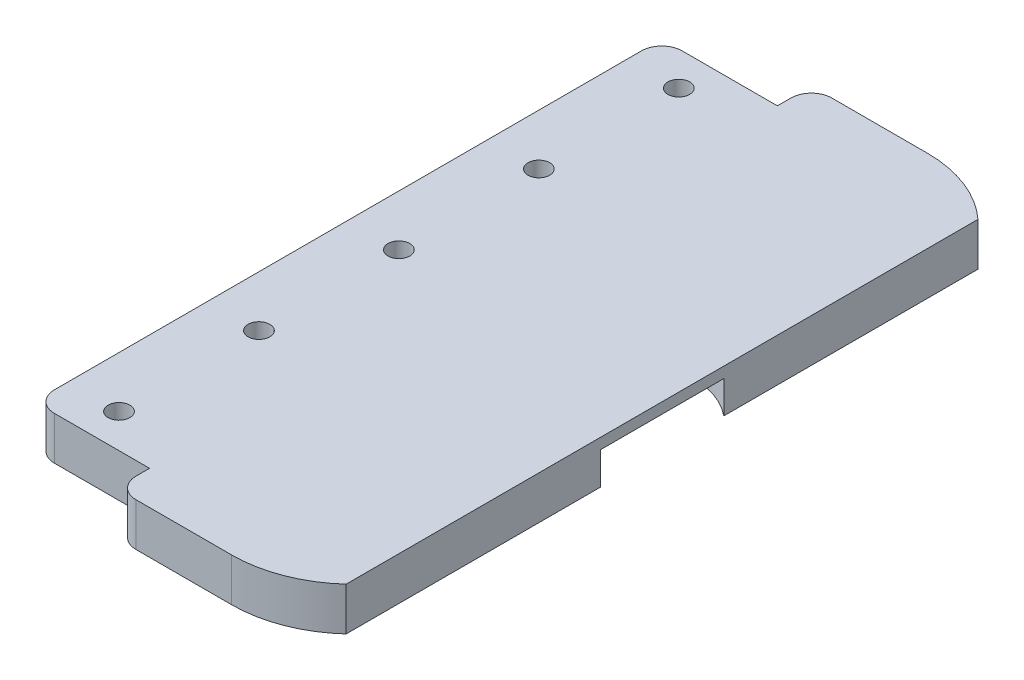
ISO-10303-21;
HEADER;
FILE_DESCRIPTION(('STEP AP214'),'2;1');
FILE_NAME('part.step','',(''),(''),'','','');
FILE_SCHEMA(('AUTOMOTIVE_DESIGN { 1 0 10303 214 1 1 1 1 }'));
ENDSEC;
DATA;
#1=APPLICATION_CONTEXT('core data for automotive mechanical design processes');
#2=APPLICATION_PROTOCOL_DEFINITION('international standard','automotive_design',2000,#1);
#3=PRODUCT_CONTEXT('',#1,'mechanical');
#4=PRODUCT('Part','Part','',(#3));
#5=PRODUCT_RELATED_PRODUCT_CATEGORY('part','',(#4));
#6=PRODUCT_DEFINITION_FORMATION('','',#4);
#7=PRODUCT_DEFINITION_CONTEXT('part definition',#1,'design');
#8=PRODUCT_DEFINITION('design','',#6,#7);
#9=PRODUCT_DEFINITION_SHAPE('','',#8);
#10=(LENGTH_UNIT() NAMED_UNIT(*) SI_UNIT(.MILLI.,.METRE.));
#11=(NAMED_UNIT(*) PLANE_ANGLE_UNIT() SI_UNIT($,.RADIAN.));
#12=(NAMED_UNIT(*) SI_UNIT($,.STERADIAN.) SOLID_ANGLE_UNIT());
#13=UNCERTAINTY_MEASURE_WITH_UNIT(LENGTH_MEASURE(1.E-05),#10,'distance_accuracy_value','');
#14=(GEOMETRIC_REPRESENTATION_CONTEXT(3) GLOBAL_UNCERTAINTY_ASSIGNED_CONTEXT((#13)) GLOBAL_UNIT_ASSIGNED_CONTEXT((#10,
#11,#12)) REPRESENTATION_CONTEXT('',''));
#15=CARTESIAN_POINT('',(0.,0.,0.));
#16=DIRECTION('',(0.,0.,1.));
#17=DIRECTION('',(1.,0.,0.));
#18=AXIS2_PLACEMENT_3D('',#15,#16,#17);
#19=CARTESIAN_POINT('',(38.876,37.2383188757529,-51.18));
#20=DIRECTION('',(0.,-1.,0.));
#21=DIRECTION('',(0.,0.,-1.));
#22=AXIS2_PLACEMENT_3D('',#19,#20,#21);
#23=CYLINDRICAL_SURFACE('',#22,11.684);
#24=DIRECTION('',(0.,-1.,0.));
#25=VECTOR('',#24,1.);
#26=CARTESIAN_POINT('',(46.2193008783632,37.2383188757529,-60.2680024323186));
#27=LINE('',#26,#25);
#28=CARTESIAN_POINT('',(46.2193008783632,4.7625,-60.2680024323186));
#29=VERTEX_POINT('',#28);
#30=CARTESIAN_POINT('',(46.2193008783632,0.,-60.2680024323186));
#31=VERTEX_POINT('',#30);
#32=EDGE_CURVE('E337',#29,#31,#27,.T.);
#33=ORIENTED_EDGE('',*,*,#32,.F.);
#34=CARTESIAN_POINT('',(38.876,4.7625,-51.18));
#35=DIRECTION('',(0.,-1.,0.));
#36=DIRECTION('',(0.,0.,-1.));
#37=AXIS2_PLACEMENT_3D('',#34,#35,#36);
#38=CIRCLE('',#37,11.684);
#39=CARTESIAN_POINT('',(30.3603757715597,4.7625,-59.18));
#40=VERTEX_POINT('',#39);
#41=EDGE_CURVE('E291',#40,#29,#38,.T.);
#42=ORIENTED_EDGE('',*,*,#41,.F.);
#43=DIRECTION('',(0.,-1.,0.));
#44=VECTOR('',#43,1.);
#45=CARTESIAN_POINT('',(30.3603757715597,37.2383188757529,-59.18));
#46=LINE('',#45,#44);
#47=CARTESIAN_POINT('',(30.3603757715597,0.,-59.18));
#48=VERTEX_POINT('',#47);
#49=EDGE_CURVE('E298',#40,#48,#46,.T.);
#50=ORIENTED_EDGE('',*,*,#49,.T.);
#51=CARTESIAN_POINT('',(38.876,0.,-51.18));
#52=DIRECTION('',(0.,1.,0.));
#53=DIRECTION('',(0.,0.,1.));
#54=AXIS2_PLACEMENT_3D('',#51,#52,#53);
#55=CIRCLE('',#54,11.684);
#56=EDGE_CURVE('E304',#31,#48,#55,.T.);
#57=ORIENTED_EDGE('',*,*,#56,.F.);
#58=EDGE_LOOP('',(#33,#42,#50,#57));
#59=FACE_BOUND('',#58,.T.);
#60=ADVANCED_FACE('F39',(#59),#23,.F.);
#61=CARTESIAN_POINT('',(0.,0.,0.));
#62=DIRECTION('',(0.,-1.,0.));
#63=DIRECTION('',(0.,0.,-1.));
#64=AXIS2_PLACEMENT_3D('',#61,#62,#63);
#65=PLANE('',#64);
#66=DIRECTION('',(0.,0.,-1.));
#67=VECTOR('',#66,1.);
#68=CARTESIAN_POINT('',(46.2193008783632,0.,-4.70584818081287));
#69=LINE('',#68,#67);
#70=CARTESIAN_POINT('',(46.2193008783632,0.,-4.70584818081287));
#71=VERTEX_POINT('',#70);
#72=CARTESIAN_POINT('',(46.2193008783632,0.,-42.0919975676814));
#73=VERTEX_POINT('',#72);
#74=EDGE_CURVE('E180',#71,#73,#69,.T.);
#75=ORIENTED_EDGE('',*,*,#74,.F.);
#76=CARTESIAN_POINT('',(34.084,0.,-18.));
#77=DIRECTION('',(0.,-1.,0.));
#78=DIRECTION('',(0.,0.,-1.));
#79=AXIS2_PLACEMENT_3D('',#76,#77,#78);
#80=CIRCLE('',#79,18.);
#81=CARTESIAN_POINT('',(34.084,0.,0.));
#82=VERTEX_POINT('',#81);
#83=EDGE_CURVE('E190',#71,#82,#80,.T.);
#84=ORIENTED_EDGE('',*,*,#83,.T.);
#85=DIRECTION('',(1.,0.,0.));
#86=VECTOR('',#85,1.);
#87=CARTESIAN_POINT('',(0.,0.,0.));
#88=LINE('',#87,#86);
#89=CARTESIAN_POINT('',(20.,0.,0.));
#90=VERTEX_POINT('',#89);
#91=EDGE_CURVE('E231',#90,#82,#88,.T.);
#92=ORIENTED_EDGE('',*,*,#91,.F.);
#93=CARTESIAN_POINT('',(20.,0.,-3.));
#94=DIRECTION('',(0.,-1.,0.));
#95=DIRECTION('',(0.,0.,-1.));
#96=AXIS2_PLACEMENT_3D('',#93,#94,#95);
#97=CIRCLE('',#96,3.);
#98=CARTESIAN_POINT('',(17.,0.,-3.));
#99=VERTEX_POINT('',#98);
#100=EDGE_CURVE('E198',#90,#99,#97,.T.);
#101=ORIENTED_EDGE('',*,*,#100,.T.);
#102=DIRECTION('',(0.,0.,-1.));
#103=VECTOR('',#102,1.);
#104=CARTESIAN_POINT('',(17.,0.,0.));
#105=LINE('',#104,#103);
#106=CARTESIAN_POINT('',(17.,0.,-5.));
#107=VERTEX_POINT('',#106);
#108=EDGE_CURVE('E341',#99,#107,#105,.T.);
#109=ORIENTED_EDGE('',*,*,#108,.T.);
#110=DIRECTION('',(-1.,0.,0.));
#111=VECTOR('',#110,1.);
#112=CARTESIAN_POINT('',(17.,0.,-5.));
#113=LINE('',#112,#111);
#114=CARTESIAN_POINT('',(3.,0.,-5.));
#115=VERTEX_POINT('',#114);
#116=EDGE_CURVE('E332',#107,#115,#113,.T.);
#117=ORIENTED_EDGE('',*,*,#116,.T.);
#118=CARTESIAN_POINT('',(3.,0.,-8.));
#119=DIRECTION('',(0.,-1.,0.));
#120=DIRECTION('',(0.,0.,-1.));
#121=AXIS2_PLACEMENT_3D('',#118,#119,#120);
#122=CIRCLE('',#121,3.);
#123=CARTESIAN_POINT('',(0.,0.,-8.));
#124=VERTEX_POINT('',#123);
#125=EDGE_CURVE('E200',#115,#124,#122,.T.);
#126=ORIENTED_EDGE('',*,*,#125,.T.);
#127=DIRECTION('',(0.,0.,-1.));
#128=VECTOR('',#127,1.);
#129=CARTESIAN_POINT('',(0.,0.,0.));
#130=LINE('',#129,#128);
#131=CARTESIAN_POINT('',(0.,0.,-94.362));
#132=VERTEX_POINT('',#131);
#133=EDGE_CURVE('E248',#124,#132,#130,.T.);
#134=ORIENTED_EDGE('',*,*,#133,.T.);
#135=CARTESIAN_POINT('',(3.,0.,-94.362));
#136=DIRECTION('',(0.,-1.,0.));
#137=DIRECTION('',(0.,0.,-1.));
#138=AXIS2_PLACEMENT_3D('',#135,#136,#137);
#139=CIRCLE('',#138,3.);
#140=CARTESIAN_POINT('',(3.,0.,-97.362));
#141=VERTEX_POINT('',#140);
#142=EDGE_CURVE('E202',#132,#141,#139,.T.);
#143=ORIENTED_EDGE('',*,*,#142,.T.);
#144=DIRECTION('',(1.,0.,0.));
#145=VECTOR('',#144,1.);
#146=CARTESIAN_POINT('',(0.,0.,-97.362));
#147=LINE('',#146,#145);
#148=CARTESIAN_POINT('',(17.,0.,-97.362));
#149=VERTEX_POINT('',#148);
#150=EDGE_CURVE('E330',#141,#149,#147,.T.);
#151=ORIENTED_EDGE('',*,*,#150,.T.);
#152=DIRECTION('',(0.,0.,1.));
#153=VECTOR('',#152,1.);
#154=CARTESIAN_POINT('',(17.,0.,-102.362));
#155=LINE('',#154,#153);
#156=CARTESIAN_POINT('',(17.,0.,-99.362));
#157=VERTEX_POINT('',#156);
#158=EDGE_CURVE('E325',#157,#149,#155,.T.);
#159=ORIENTED_EDGE('',*,*,#158,.F.);
#160=CARTESIAN_POINT('',(20.,0.,-99.362));
#161=DIRECTION('',(0.,-1.,0.));
#162=DIRECTION('',(0.,0.,-1.));
#163=AXIS2_PLACEMENT_3D('',#160,#161,#162);
#164=CIRCLE('',#163,3.);
#165=CARTESIAN_POINT('',(20.,0.,-102.362));
#166=VERTEX_POINT('',#165);
#167=EDGE_CURVE('E204',#157,#166,#164,.T.);
#168=ORIENTED_EDGE('',*,*,#167,.T.);
#169=DIRECTION('',(1.,0.,0.));
#170=VECTOR('',#169,1.);
#171=CARTESIAN_POINT('',(0.,0.,-102.362));
#172=LINE('',#171,#170);
#173=CARTESIAN_POINT('',(34.084,0.,-102.362));
#174=VERTEX_POINT('',#173);
#175=EDGE_CURVE('E243',#166,#174,#172,.T.);
#176=ORIENTED_EDGE('',*,*,#175,.T.);
#177=CARTESIAN_POINT('',(34.084,0.,-84.362));
#178=DIRECTION('',(0.,-1.,0.));
#179=DIRECTION('',(0.,0.,-1.));
#180=AXIS2_PLACEMENT_3D('',#177,#178,#179);
#181=CIRCLE('',#180,18.);
#182=CARTESIAN_POINT('',(46.2193008783632,0.,-97.6561518191871));
#183=VERTEX_POINT('',#182);
#184=EDGE_CURVE('E252',#174,#183,#181,.T.);
#185=ORIENTED_EDGE('',*,*,#184,.T.);
#186=EDGE_CURVE('E54',#31,#183,#69,.T.);
#187=ORIENTED_EDGE('',*,*,#186,.F.);
#188=ORIENTED_EDGE('',*,*,#56,.T.);
#189=DIRECTION('',(0.,0.,-1.));
#190=VECTOR('',#189,1.);
#191=CARTESIAN_POINT('',(30.3603757715597,0.,0.));
#192=LINE('',#191,#190);
#193=CARTESIAN_POINT('',(30.3603757715597,0.,-43.18));
#194=VERTEX_POINT('',#193);
#195=EDGE_CURVE('E305',#194,#48,#192,.T.);
#196=ORIENTED_EDGE('',*,*,#195,.F.);
#197=EDGE_CURVE('E301',#194,#73,#55,.T.);
#198=ORIENTED_EDGE('',*,*,#197,.T.);
#199=EDGE_LOOP('',(#75,#84,#92,#101,#109,#117,#126,#134,#143,#151,#159,#168,#176,#185,#187,#188,
#196,#198));
#200=FACE_BOUND('',#199,.T.);
#201=CARTESIAN_POINT('',(38.876,0.,-95.63));
#202=DIRECTION('',(0.,1.,0.));
#203=DIRECTION('',(0.,0.,1.));
#204=AXIS2_PLACEMENT_3D('',#201,#202,#203);
#205=CIRCLE('',#204,3.55600000000001);
#206=CARTESIAN_POINT('',(38.876,0.,-92.074));
#207=VERTEX_POINT('',#206);
#208=EDGE_CURVE('E308',#207,#207,#205,.T.);
#209=ORIENTED_EDGE('',*,*,#208,.T.);
#210=EDGE_LOOP('',(#209));
#211=FACE_BOUND('',#210,.T.);
#212=CARTESIAN_POINT('',(7.50000000000086,0.,-10.002));
#213=DIRECTION('',(0.,1.,0.));
#214=DIRECTION('',(0.,0.,1.));
#215=AXIS2_PLACEMENT_3D('',#212,#213,#214);
#216=CIRCLE('',#215,1.6);
#217=CARTESIAN_POINT('',(7.50000000000086,0.,-8.40200000000001));
#218=VERTEX_POINT('',#217);
#219=EDGE_CURVE('E270',#218,#218,#216,.T.);
#220=ORIENTED_EDGE('',*,*,#219,.T.);
#221=EDGE_LOOP('',(#220));
#222=FACE_BOUND('',#221,.T.);
#223=CARTESIAN_POINT('',(7.50000000000065,0.,-30.592));
#224=DIRECTION('',(0.,1.,0.));
#225=DIRECTION('',(0.,0.,1.));
#226=AXIS2_PLACEMENT_3D('',#223,#224,#225);
#227=CIRCLE('',#226,1.6);
#228=CARTESIAN_POINT('',(7.50000000000065,0.,-28.992));
#229=VERTEX_POINT('',#228);
#230=EDGE_CURVE('E277',#229,#229,#227,.T.);
#231=ORIENTED_EDGE('',*,*,#230,.T.);
#232=EDGE_LOOP('',(#231));
#233=FACE_BOUND('',#232,.T.);
#234=CARTESIAN_POINT('',(7.50000000000043,0.,-51.182));
#235=DIRECTION('',(0.,1.,0.));
#236=DIRECTION('',(0.,0.,1.));
#237=AXIS2_PLACEMENT_3D('',#234,#235,#236);
#238=CIRCLE('',#237,1.6);
#239=CARTESIAN_POINT('',(7.50000000000043,0.,-49.582));
#240=VERTEX_POINT('',#239);
#241=EDGE_CURVE('E283',#240,#240,#238,.T.);
#242=ORIENTED_EDGE('',*,*,#241,.T.);
#243=EDGE_LOOP('',(#242));
#244=FACE_BOUND('',#243,.T.);
#245=CARTESIAN_POINT('',(7.5,0.,-92.362));
#246=DIRECTION('',(0.,1.,0.));
#247=DIRECTION('',(0.,0.,1.));
#248=AXIS2_PLACEMENT_3D('',#245,#246,#247);
#249=CIRCLE('',#248,1.6);
#250=CARTESIAN_POINT('',(7.5,0.,-90.762));
#251=VERTEX_POINT('',#250);
#252=EDGE_CURVE('E264',#251,#251,#249,.T.);
#253=ORIENTED_EDGE('',*,*,#252,.T.);
#254=EDGE_LOOP('',(#253));
#255=FACE_BOUND('',#254,.T.);
#256=CARTESIAN_POINT('',(7.50000000000022,0.,-71.772));
#257=DIRECTION('',(0.,1.,0.));
#258=DIRECTION('',(0.,0.,1.));
#259=AXIS2_PLACEMENT_3D('',#256,#257,#258);
#260=CIRCLE('',#259,1.6);
#261=CARTESIAN_POINT('',(7.50000000000022,0.,-70.172));
#262=VERTEX_POINT('',#261);
#263=EDGE_CURVE('E259',#262,#262,#260,.T.);
#264=ORIENTED_EDGE('',*,*,#263,.T.);
#265=EDGE_LOOP('',(#264));
#266=FACE_BOUND('',#265,.T.);
#267=CARTESIAN_POINT('',(38.876,0.,-6.73));
#268=DIRECTION('',(0.,1.,0.));
#269=DIRECTION('',(0.,0.,1.));
#270=AXIS2_PLACEMENT_3D('',#267,#268,#269);
#271=CIRCLE('',#270,3.556);
#272=CARTESIAN_POINT('',(38.876,0.,-3.174));
#273=VERTEX_POINT('',#272);
#274=EDGE_CURVE('E311',#273,#273,#271,.T.);
#275=ORIENTED_EDGE('',*,*,#274,.T.);
#276=EDGE_LOOP('',(#275));
#277=FACE_BOUND('',#276,.T.);
#278=ADVANCED_FACE('F238',(#200,#211,#222,#233,#244,#255,#266,#277),#65,.T.);
#279=CARTESIAN_POINT('',(0.,6.35,0.));
#280=DIRECTION('',(-1.,0.,0.));
#281=DIRECTION('',(0.,0.,1.));
#282=AXIS2_PLACEMENT_3D('',#279,#280,#281);
#283=PLANE('',#282);
#284=DIRECTION('',(0.,0.,-1.));
#285=VECTOR('',#284,1.);
#286=CARTESIAN_POINT('',(0.,6.35,0.));
#287=LINE('',#286,#285);
#288=CARTESIAN_POINT('',(0.,6.35,-8.));
#289=VERTEX_POINT('',#288);
#290=CARTESIAN_POINT('',(0.,6.35,-94.362));
#291=VERTEX_POINT('',#290);
#292=EDGE_CURVE('E242',#289,#291,#287,.T.);
#293=ORIENTED_EDGE('',*,*,#292,.T.);
#294=DIRECTION('',(0.,-1.,0.));
#295=VECTOR('',#294,1.);
#296=CARTESIAN_POINT('',(0.,6.35,-94.362));
#297=LINE('',#296,#295);
#298=EDGE_CURVE('E217',#291,#132,#297,.T.);
#299=ORIENTED_EDGE('',*,*,#298,.T.);
#300=ORIENTED_EDGE('',*,*,#133,.F.);
#301=DIRECTION('',(0.,-1.,0.));
#302=VECTOR('',#301,1.);
#303=CARTESIAN_POINT('',(0.,6.35,-8.));
#304=LINE('',#303,#302);
#305=EDGE_CURVE('E215',#124,#289,#304,.F.);
#306=ORIENTED_EDGE('',*,*,#305,.T.);
#307=EDGE_LOOP('',(#293,#299,#300,#306));
#308=FACE_BOUND('',#307,.T.);
#309=ADVANCED_FACE('F375',(#308),#283,.T.);
#310=CARTESIAN_POINT('',(0.,6.35,0.));
#311=DIRECTION('',(0.,0.,-1.));
#312=DIRECTION('',(-1.,0.,0.));
#313=AXIS2_PLACEMENT_3D('',#310,#311,#312);
#314=PLANE('',#313);
#315=DIRECTION('',(1.,0.,0.));
#316=VECTOR('',#315,1.);
#317=CARTESIAN_POINT('',(0.,6.35,0.));
#318=LINE('',#317,#316);
#319=CARTESIAN_POINT('',(20.,6.35,0.));
#320=VERTEX_POINT('',#319);
#321=CARTESIAN_POINT('',(34.084,6.35,0.));
#322=VERTEX_POINT('',#321);
#323=EDGE_CURVE('E233',#320,#322,#318,.T.);
#324=ORIENTED_EDGE('',*,*,#323,.F.);
#325=DIRECTION('',(0.,-1.,0.));
#326=VECTOR('',#325,1.);
#327=CARTESIAN_POINT('',(20.,0.,0.));
#328=LINE('',#327,#326);
#329=EDGE_CURVE('E47',#320,#90,#328,.T.);
#330=ORIENTED_EDGE('',*,*,#329,.T.);
#331=ORIENTED_EDGE('',*,*,#91,.T.);
#332=DIRECTION('',(0.,-1.,0.));
#333=VECTOR('',#332,1.);
#334=CARTESIAN_POINT('',(34.084,6.35,0.));
#335=LINE('',#334,#333);
#336=EDGE_CURVE('E186',#82,#322,#335,.F.);
#337=ORIENTED_EDGE('',*,*,#336,.T.);
#338=EDGE_LOOP('',(#324,#330,#331,#337));
#339=FACE_BOUND('',#338,.T.);
#340=ADVANCED_FACE('F230',(#339),#314,.F.);
#341=CARTESIAN_POINT('',(0.,6.35,0.));
#342=DIRECTION('',(0.,-1.,0.));
#343=DIRECTION('',(0.,0.,-1.));
#344=AXIS2_PLACEMENT_3D('',#341,#342,#343);
#345=PLANE('',#344);
#346=CARTESIAN_POINT('',(7.50000000000086,6.35,-10.002));
#347=DIRECTION('',(0.,1.,0.));
#348=DIRECTION('',(0.,0.,1.));
#349=AXIS2_PLACEMENT_3D('',#346,#347,#348);
#350=CIRCLE('',#349,1.6);
#351=CARTESIAN_POINT('',(7.50000000000086,6.35,-8.40200000000001));
#352=VERTEX_POINT('',#351);
#353=EDGE_CURVE('E267',#352,#352,#350,.T.);
#354=ORIENTED_EDGE('',*,*,#353,.F.);
#355=EDGE_LOOP('',(#354));
#356=FACE_BOUND('',#355,.T.);
#357=CARTESIAN_POINT('',(7.50000000000065,6.35,-30.592));
#358=DIRECTION('',(0.,1.,0.));
#359=DIRECTION('',(0.,0.,1.));
#360=AXIS2_PLACEMENT_3D('',#357,#358,#359);
#361=CIRCLE('',#360,1.6);
#362=CARTESIAN_POINT('',(7.50000000000065,6.35,-28.992));
#363=VERTEX_POINT('',#362);
#364=EDGE_CURVE('E274',#363,#363,#361,.T.);
#365=ORIENTED_EDGE('',*,*,#364,.F.);
#366=EDGE_LOOP('',(#365));
#367=FACE_BOUND('',#366,.T.);
#368=CARTESIAN_POINT('',(7.50000000000043,6.35,-51.182));
#369=DIRECTION('',(0.,1.,0.));
#370=DIRECTION('',(0.,0.,1.));
#371=AXIS2_PLACEMENT_3D('',#368,#369,#370);
#372=CIRCLE('',#371,1.6);
#373=CARTESIAN_POINT('',(7.50000000000043,6.35,-49.582));
#374=VERTEX_POINT('',#373);
#375=EDGE_CURVE('E280',#374,#374,#372,.T.);
#376=ORIENTED_EDGE('',*,*,#375,.F.);
#377=EDGE_LOOP('',(#376));
#378=FACE_BOUND('',#377,.T.);
#379=CARTESIAN_POINT('',(7.5,6.35,-92.362));
#380=DIRECTION('',(0.,1.,0.));
#381=DIRECTION('',(0.,0.,1.));
#382=AXIS2_PLACEMENT_3D('',#379,#380,#381);
#383=CIRCLE('',#382,1.6);
#384=CARTESIAN_POINT('',(7.5,6.35,-90.762));
#385=VERTEX_POINT('',#384);
#386=EDGE_CURVE('E286',#385,#385,#383,.T.);
#387=ORIENTED_EDGE('',*,*,#386,.F.);
#388=EDGE_LOOP('',(#387));
#389=FACE_BOUND('',#388,.T.);
#390=CARTESIAN_POINT('',(7.50000000000022,6.35,-71.772));
#391=DIRECTION('',(0.,1.,0.));
#392=DIRECTION('',(0.,0.,1.));
#393=AXIS2_PLACEMENT_3D('',#390,#391,#392);
#394=CIRCLE('',#393,1.6);
#395=CARTESIAN_POINT('',(7.50000000000022,6.35,-70.172));
#396=VERTEX_POINT('',#395);
#397=EDGE_CURVE('E256',#396,#396,#394,.T.);
#398=ORIENTED_EDGE('',*,*,#397,.F.);
#399=EDGE_LOOP('',(#398));
#400=FACE_BOUND('',#399,.T.);
#401=CARTESIAN_POINT('',(34.084,6.35,-18.));
#402=DIRECTION('',(0.,-1.,0.));
#403=DIRECTION('',(0.,0.,-1.));
#404=AXIS2_PLACEMENT_3D('',#401,#402,#403);
#405=CIRCLE('',#404,18.);
#406=CARTESIAN_POINT('',(46.2193008783632,6.35,-4.70584818081287));
#407=VERTEX_POINT('',#406);
#408=EDGE_CURVE('E179',#322,#407,#405,.F.);
#409=ORIENTED_EDGE('',*,*,#408,.T.);
#410=DIRECTION('',(0.,0.,-1.));
#411=VECTOR('',#410,1.);
#412=CARTESIAN_POINT('',(46.2193008783632,6.35,-4.70584818081287));
#413=LINE('',#412,#411);
#414=CARTESIAN_POINT('',(46.2193008783632,6.35,-97.6561518191871));
#415=VERTEX_POINT('',#414);
#416=EDGE_CURVE('E165',#407,#415,#413,.T.);
#417=ORIENTED_EDGE('',*,*,#416,.T.);
#418=CARTESIAN_POINT('',(34.084,6.35,-84.362));
#419=DIRECTION('',(0.,-1.,0.));
#420=DIRECTION('',(0.,0.,-1.));
#421=AXIS2_PLACEMENT_3D('',#418,#419,#420);
#422=CIRCLE('',#421,18.);
#423=CARTESIAN_POINT('',(34.084,6.35,-102.362));
#424=VERTEX_POINT('',#423);
#425=EDGE_CURVE('E176',#415,#424,#422,.F.);
#426=ORIENTED_EDGE('',*,*,#425,.T.);
#427=DIRECTION('',(1.,0.,0.));
#428=VECTOR('',#427,1.);
#429=CARTESIAN_POINT('',(0.,6.35,-102.362));
#430=LINE('',#429,#428);
#431=CARTESIAN_POINT('',(20.,6.35,-102.362));
#432=VERTEX_POINT('',#431);
#433=EDGE_CURVE('E246',#432,#424,#430,.T.);
#434=ORIENTED_EDGE('',*,*,#433,.F.);
#435=CARTESIAN_POINT('',(20.,6.35,-99.362));
#436=DIRECTION('',(0.,-1.,0.));
#437=DIRECTION('',(0.,0.,-1.));
#438=AXIS2_PLACEMENT_3D('',#435,#436,#437);
#439=CIRCLE('',#438,3.);
#440=CARTESIAN_POINT('',(17.,6.35,-99.362));
#441=VERTEX_POINT('',#440);
#442=EDGE_CURVE('E213',#432,#441,#439,.F.);
#443=ORIENTED_EDGE('',*,*,#442,.T.);
#444=DIRECTION('',(0.,0.,1.));
#445=VECTOR('',#444,1.);
#446=CARTESIAN_POINT('',(17.,6.35,-102.362));
#447=LINE('',#446,#445);
#448=CARTESIAN_POINT('',(17.,6.35,-97.362));
#449=VERTEX_POINT('',#448);
#450=EDGE_CURVE('E326',#441,#449,#447,.T.);
#451=ORIENTED_EDGE('',*,*,#450,.T.);
#452=DIRECTION('',(1.,0.,0.));
#453=VECTOR('',#452,1.);
#454=CARTESIAN_POINT('',(0.,6.35,-97.362));
#455=LINE('',#454,#453);
#456=CARTESIAN_POINT('',(3.,6.35,-97.362));
#457=VERTEX_POINT('',#456);
#458=EDGE_CURVE('E323',#457,#449,#455,.T.);
#459=ORIENTED_EDGE('',*,*,#458,.F.);
#460=CARTESIAN_POINT('',(3.,6.35,-94.362));
#461=DIRECTION('',(0.,-1.,0.));
#462=DIRECTION('',(0.,0.,-1.));
#463=AXIS2_PLACEMENT_3D('',#460,#461,#462);
#464=CIRCLE('',#463,3.);
#465=EDGE_CURVE('E211',#457,#291,#464,.F.);
#466=ORIENTED_EDGE('',*,*,#465,.T.);
#467=ORIENTED_EDGE('',*,*,#292,.F.);
#468=CARTESIAN_POINT('',(3.,6.35,-8.));
#469=DIRECTION('',(0.,-1.,0.));
#470=DIRECTION('',(0.,0.,-1.));
#471=AXIS2_PLACEMENT_3D('',#468,#469,#470);
#472=CIRCLE('',#471,3.);
#473=CARTESIAN_POINT('',(3.,6.35,-5.));
#474=VERTEX_POINT('',#473);
#475=EDGE_CURVE('E62',#289,#474,#472,.F.);
#476=ORIENTED_EDGE('',*,*,#475,.T.);
#477=DIRECTION('',(-1.,0.,0.));
#478=VECTOR('',#477,1.);
#479=CARTESIAN_POINT('',(17.,6.35,-5.));
#480=LINE('',#479,#478);
#481=CARTESIAN_POINT('',(17.,6.35,-5.));
#482=VERTEX_POINT('',#481);
#483=EDGE_CURVE('E343',#482,#474,#480,.T.);
#484=ORIENTED_EDGE('',*,*,#483,.F.);
#485=DIRECTION('',(0.,0.,-1.));
#486=VECTOR('',#485,1.);
#487=CARTESIAN_POINT('',(17.,6.35,0.));
#488=LINE('',#487,#486);
#489=CARTESIAN_POINT('',(17.,6.35,-3.));
#490=VERTEX_POINT('',#489);
#491=EDGE_CURVE('E340',#490,#482,#488,.T.);
#492=ORIENTED_EDGE('',*,*,#491,.F.);
#493=CARTESIAN_POINT('',(20.,6.35,-3.));
#494=DIRECTION('',(0.,-1.,0.));
#495=DIRECTION('',(0.,0.,-1.));
#496=AXIS2_PLACEMENT_3D('',#493,#494,#495);
#497=CIRCLE('',#496,3.);
#498=EDGE_CURVE('E208',#490,#320,#497,.F.);
#499=ORIENTED_EDGE('',*,*,#498,.T.);
#500=ORIENTED_EDGE('',*,*,#323,.T.);
#501=EDGE_LOOP('',(#409,#417,#426,#434,#443,#451,#459,#466,#467,#476,#484,#492,#499,#500));
#502=FACE_BOUND('',#501,.T.);
#503=ADVANCED_FACE('F174',(#356,#367,#378,#389,#400,#502),#345,.F.);
#504=CARTESIAN_POINT('',(0.,6.35,-102.362));
#505=DIRECTION('',(0.,0.,-1.));
#506=DIRECTION('',(-1.,0.,0.));
#507=AXIS2_PLACEMENT_3D('',#504,#505,#506);
#508=PLANE('',#507);
#509=ORIENTED_EDGE('',*,*,#175,.F.);
#510=DIRECTION('',(0.,-1.,0.));
#511=VECTOR('',#510,1.);
#512=CARTESIAN_POINT('',(20.,6.35,-102.362));
#513=LINE('',#512,#511);
#514=EDGE_CURVE('E206',#166,#432,#513,.F.);
#515=ORIENTED_EDGE('',*,*,#514,.T.);
#516=ORIENTED_EDGE('',*,*,#433,.T.);
#517=DIRECTION('',(0.,-1.,0.));
#518=VECTOR('',#517,1.);
#519=CARTESIAN_POINT('',(34.084,0.,-102.362));
#520=LINE('',#519,#518);
#521=EDGE_CURVE('E185',#424,#174,#520,.T.);
#522=ORIENTED_EDGE('',*,*,#521,.T.);
#523=EDGE_LOOP('',(#509,#515,#516,#522));
#524=FACE_BOUND('',#523,.T.);
#525=ADVANCED_FACE('F401',(#524),#508,.T.);
#526=CARTESIAN_POINT('',(7.50000000000022,6.35,-71.772));
#527=DIRECTION('',(0.,-1.,0.));
#528=DIRECTION('',(0.,0.,-1.));
#529=AXIS2_PLACEMENT_3D('',#526,#527,#528);
#530=CYLINDRICAL_SURFACE('',#529,1.6);
#531=ORIENTED_EDGE('',*,*,#397,.T.);
#532=EDGE_LOOP('',(#531));
#533=FACE_BOUND('',#532,.T.);
#534=ORIENTED_EDGE('',*,*,#263,.F.);
#535=EDGE_LOOP('',(#534));
#536=FACE_BOUND('',#535,.T.);
#537=ADVANCED_FACE('F397',(#533,#536),#530,.F.);
#538=CARTESIAN_POINT('',(7.5,6.35,-92.362));
#539=DIRECTION('',(0.,-1.,0.));
#540=DIRECTION('',(0.,0.,-1.));
#541=AXIS2_PLACEMENT_3D('',#538,#539,#540);
#542=CYLINDRICAL_SURFACE('',#541,1.6);
#543=ORIENTED_EDGE('',*,*,#386,.T.);
#544=EDGE_LOOP('',(#543));
#545=FACE_BOUND('',#544,.T.);
#546=ORIENTED_EDGE('',*,*,#252,.F.);
#547=EDGE_LOOP('',(#546));
#548=FACE_BOUND('',#547,.T.);
#549=ADVANCED_FACE('F400',(#545,#548),#542,.F.);
#550=CARTESIAN_POINT('',(7.50000000000043,6.35,-51.182));
#551=DIRECTION('',(0.,-1.,0.));
#552=DIRECTION('',(0.,0.,-1.));
#553=AXIS2_PLACEMENT_3D('',#550,#551,#552);
#554=CYLINDRICAL_SURFACE('',#553,1.6);
#555=ORIENTED_EDGE('',*,*,#375,.T.);
#556=EDGE_LOOP('',(#555));
#557=FACE_BOUND('',#556,.T.);
#558=ORIENTED_EDGE('',*,*,#241,.F.);
#559=EDGE_LOOP('',(#558));
#560=FACE_BOUND('',#559,.T.);
#561=ADVANCED_FACE('F391',(#557,#560),#554,.F.);
#562=CARTESIAN_POINT('',(7.50000000000065,6.35,-30.592));
#563=DIRECTION('',(0.,-1.,0.));
#564=DIRECTION('',(0.,0.,-1.));
#565=AXIS2_PLACEMENT_3D('',#562,#563,#564);
#566=CYLINDRICAL_SURFACE('',#565,1.6);
#567=ORIENTED_EDGE('',*,*,#364,.T.);
#568=EDGE_LOOP('',(#567));
#569=FACE_BOUND('',#568,.T.);
#570=ORIENTED_EDGE('',*,*,#230,.F.);
#571=EDGE_LOOP('',(#570));
#572=FACE_BOUND('',#571,.T.);
#573=ADVANCED_FACE('F385',(#569,#572),#566,.F.);
#574=CARTESIAN_POINT('',(7.50000000000086,6.35,-10.002));
#575=DIRECTION('',(0.,-1.,0.));
#576=DIRECTION('',(0.,0.,-1.));
#577=AXIS2_PLACEMENT_3D('',#574,#575,#576);
#578=CYLINDRICAL_SURFACE('',#577,1.6);
#579=ORIENTED_EDGE('',*,*,#353,.T.);
#580=EDGE_LOOP('',(#579));
#581=FACE_BOUND('',#580,.T.);
#582=ORIENTED_EDGE('',*,*,#219,.F.);
#583=EDGE_LOOP('',(#582));
#584=FACE_BOUND('',#583,.T.);
#585=ADVANCED_FACE('F380',(#581,#584),#578,.F.);
#586=DIRECTION('',(0.,-1.,0.));
#587=VECTOR('',#586,1.);
#588=CARTESIAN_POINT('',(46.2193008783632,37.2383188757529,-42.0919975676814));
#589=LINE('',#588,#587);
#590=CARTESIAN_POINT('',(46.2193008783632,4.7625,-42.0919975676814));
#591=VERTEX_POINT('',#590);
#592=EDGE_CURVE('E349',#73,#591,#589,.F.);
#593=ORIENTED_EDGE('',*,*,#592,.F.);
#594=ORIENTED_EDGE('',*,*,#197,.F.);
#595=DIRECTION('',(0.,-1.,0.));
#596=VECTOR('',#595,1.);
#597=CARTESIAN_POINT('',(30.3603757715597,37.2383188757529,-43.18));
#598=LINE('',#597,#596);
#599=CARTESIAN_POINT('',(30.3603757715597,4.7625,-43.18));
#600=VERTEX_POINT('',#599);
#601=EDGE_CURVE('E295',#600,#194,#598,.T.);
#602=ORIENTED_EDGE('',*,*,#601,.F.);
#603=EDGE_CURVE('E294',#591,#600,#38,.T.);
#604=ORIENTED_EDGE('',*,*,#603,.F.);
#605=EDGE_LOOP('',(#593,#594,#602,#604));
#606=FACE_BOUND('',#605,.T.);
#607=ADVANCED_FACE('F358',(#606),#23,.F.);
#608=CARTESIAN_POINT('',(30.3603757715597,37.2383188757529,0.));
#609=DIRECTION('',(-1.,0.,0.));
#610=DIRECTION('',(0.,0.,1.));
#611=AXIS2_PLACEMENT_3D('',#608,#609,#610);
#612=PLANE('',#611);
#613=DIRECTION('',(0.,0.,1.));
#614=VECTOR('',#613,1.);
#615=CARTESIAN_POINT('',(30.3603757715597,4.7625,0.));
#616=LINE('',#615,#614);
#617=EDGE_CURVE('E271',#40,#600,#616,.T.);
#618=ORIENTED_EDGE('',*,*,#617,.T.);
#619=ORIENTED_EDGE('',*,*,#601,.T.);
#620=ORIENTED_EDGE('',*,*,#195,.T.);
#621=ORIENTED_EDGE('',*,*,#49,.F.);
#622=EDGE_LOOP('',(#618,#619,#620,#621));
#623=FACE_BOUND('',#622,.T.);
#624=ADVANCED_FACE('F364',(#623),#612,.F.);
#625=CARTESIAN_POINT('',(0.,4.7625,0.));
#626=DIRECTION('',(0.,-1.,0.));
#627=DIRECTION('',(0.,0.,-1.));
#628=AXIS2_PLACEMENT_3D('',#625,#626,#627);
#629=PLANE('',#628);
#630=DIRECTION('',(0.,0.,-1.));
#631=VECTOR('',#630,1.);
#632=CARTESIAN_POINT('',(46.2193008783632,4.7625,0.));
#633=LINE('',#632,#631);
#634=EDGE_CURVE('E351',#591,#29,#633,.T.);
#635=ORIENTED_EDGE('',*,*,#634,.F.);
#636=ORIENTED_EDGE('',*,*,#603,.T.);
#637=ORIENTED_EDGE('',*,*,#617,.F.);
#638=ORIENTED_EDGE('',*,*,#41,.T.);
#639=EDGE_LOOP('',(#635,#636,#637,#638));
#640=FACE_BOUND('',#639,.T.);
#641=ADVANCED_FACE('F367',(#640),#629,.T.);
#642=CARTESIAN_POINT('',(38.876,37.2383188757529,-95.63));
#643=DIRECTION('',(0.,-1.,0.));
#644=DIRECTION('',(0.,0.,-1.));
#645=AXIS2_PLACEMENT_3D('',#642,#643,#644);
#646=CYLINDRICAL_SURFACE('',#645,3.55600000000001);
#647=CARTESIAN_POINT('',(38.876,4.7625,-95.63));
#648=DIRECTION('',(0.,-1.,0.));
#649=DIRECTION('',(0.,0.,-1.));
#650=AXIS2_PLACEMENT_3D('',#647,#648,#649);
#651=CIRCLE('',#650,3.55600000000001);
#652=CARTESIAN_POINT('',(38.876,4.7625,-99.186));
#653=VERTEX_POINT('',#652);
#654=EDGE_CURVE('E314',#653,#653,#651,.T.);
#655=ORIENTED_EDGE('',*,*,#654,.F.);
#656=EDGE_LOOP('',(#655));
#657=FACE_BOUND('',#656,.T.);
#658=ORIENTED_EDGE('',*,*,#208,.F.);
#659=EDGE_LOOP('',(#658));
#660=FACE_BOUND('',#659,.T.);
#661=ADVANCED_FACE('F459',(#657,#660),#646,.F.);
#662=CARTESIAN_POINT('',(0.,4.7625,0.));
#663=DIRECTION('',(0.,-1.,0.));
#664=DIRECTION('',(0.,0.,-1.));
#665=AXIS2_PLACEMENT_3D('',#662,#663,#664);
#666=PLANE('',#665);
#667=ORIENTED_EDGE('',*,*,#654,.T.);
#668=EDGE_LOOP('',(#667));
#669=FACE_BOUND('',#668,.T.);
#670=ADVANCED_FACE('F462',(#669),#666,.T.);
#671=CARTESIAN_POINT('',(38.876,37.2383188757529,-6.73));
#672=DIRECTION('',(0.,-1.,0.));
#673=DIRECTION('',(0.,0.,-1.));
#674=AXIS2_PLACEMENT_3D('',#671,#672,#673);
#675=CYLINDRICAL_SURFACE('',#674,3.556);
#676=CARTESIAN_POINT('',(38.876,4.7625,-6.73));
#677=DIRECTION('',(0.,-1.,0.));
#678=DIRECTION('',(0.,0.,-1.));
#679=AXIS2_PLACEMENT_3D('',#676,#677,#678);
#680=CIRCLE('',#679,3.556);
#681=CARTESIAN_POINT('',(38.876,4.7625,-10.286));
#682=VERTEX_POINT('',#681);
#683=EDGE_CURVE('E315',#682,#682,#680,.T.);
#684=ORIENTED_EDGE('',*,*,#683,.F.);
#685=EDGE_LOOP('',(#684));
#686=FACE_BOUND('',#685,.T.);
#687=ORIENTED_EDGE('',*,*,#274,.F.);
#688=EDGE_LOOP('',(#687));
#689=FACE_BOUND('',#688,.T.);
#690=ADVANCED_FACE('F466',(#686,#689),#675,.F.);
#691=CARTESIAN_POINT('',(0.,4.7625,0.));
#692=DIRECTION('',(0.,-1.,0.));
#693=DIRECTION('',(0.,0.,-1.));
#694=AXIS2_PLACEMENT_3D('',#691,#692,#693);
#695=PLANE('',#694);
#696=ORIENTED_EDGE('',*,*,#683,.T.);
#697=EDGE_LOOP('',(#696));
#698=FACE_BOUND('',#697,.T.);
#699=ADVANCED_FACE('F416',(#698),#695,.T.);
#700=CARTESIAN_POINT('',(34.084,6.35,-18.));
#701=DIRECTION('',(0.,-1.,0.));
#702=DIRECTION('',(0.,0.,-1.));
#703=AXIS2_PLACEMENT_3D('',#700,#701,#702);
#704=CYLINDRICAL_SURFACE('',#703,18.);
#705=DIRECTION('',(0.,-1.,0.));
#706=VECTOR('',#705,1.);
#707=CARTESIAN_POINT('',(46.2193008783632,6.35,-4.70584818081287));
#708=LINE('',#707,#706);
#709=EDGE_CURVE('E171',#407,#71,#708,.T.);
#710=ORIENTED_EDGE('',*,*,#709,.F.);
#711=ORIENTED_EDGE('',*,*,#408,.F.);
#712=ORIENTED_EDGE('',*,*,#336,.F.);
#713=ORIENTED_EDGE('',*,*,#83,.F.);
#714=EDGE_LOOP('',(#710,#711,#712,#713));
#715=FACE_BOUND('',#714,.T.);
#716=ADVANCED_FACE('F413',(#715),#704,.T.);
#717=CARTESIAN_POINT('',(34.084,6.35,-84.362));
#718=DIRECTION('',(0.,1.,0.));
#719=DIRECTION('',(0.,0.,1.));
#720=AXIS2_PLACEMENT_3D('',#717,#718,#719);
#721=CYLINDRICAL_SURFACE('',#720,18.);
#722=DIRECTION('',(0.,-1.,0.));
#723=VECTOR('',#722,1.);
#724=CARTESIAN_POINT('',(46.2193008783632,6.35,-97.6561518191871));
#725=LINE('',#724,#723);
#726=EDGE_CURVE('E162',#415,#183,#725,.T.);
#727=ORIENTED_EDGE('',*,*,#726,.T.);
#728=ORIENTED_EDGE('',*,*,#184,.F.);
#729=ORIENTED_EDGE('',*,*,#521,.F.);
#730=ORIENTED_EDGE('',*,*,#425,.F.);
#731=EDGE_LOOP('',(#727,#728,#729,#730));
#732=FACE_BOUND('',#731,.T.);
#733=ADVANCED_FACE('F183',(#732),#721,.T.);
#734=CARTESIAN_POINT('',(0.,6.35,-97.362));
#735=DIRECTION('',(0.,0.,-1.));
#736=DIRECTION('',(-1.,0.,0.));
#737=AXIS2_PLACEMENT_3D('',#734,#735,#736);
#738=PLANE('',#737);
#739=ORIENTED_EDGE('',*,*,#150,.F.);
#740=DIRECTION('',(0.,-1.,0.));
#741=VECTOR('',#740,1.);
#742=CARTESIAN_POINT('',(3.,6.35,-97.362));
#743=LINE('',#742,#741);
#744=EDGE_CURVE('E220',#141,#457,#743,.F.);
#745=ORIENTED_EDGE('',*,*,#744,.T.);
#746=ORIENTED_EDGE('',*,*,#458,.T.);
#747=DIRECTION('',(0.,-1.,0.));
#748=VECTOR('',#747,1.);
#749=CARTESIAN_POINT('',(17.,6.35,-97.362));
#750=LINE('',#749,#748);
#751=EDGE_CURVE('E329',#449,#149,#750,.T.);
#752=ORIENTED_EDGE('',*,*,#751,.T.);
#753=EDGE_LOOP('',(#739,#745,#746,#752));
#754=FACE_BOUND('',#753,.T.);
#755=ADVANCED_FACE('F420',(#754),#738,.T.);
#756=CARTESIAN_POINT('',(17.,6.35,-102.362));
#757=DIRECTION('',(1.,0.,0.));
#758=DIRECTION('',(0.,0.,-1.));
#759=AXIS2_PLACEMENT_3D('',#756,#757,#758);
#760=PLANE('',#759);
#761=ORIENTED_EDGE('',*,*,#450,.F.);
#762=DIRECTION('',(0.,-1.,0.));
#763=VECTOR('',#762,1.);
#764=CARTESIAN_POINT('',(17.,0.,-99.362));
#765=LINE('',#764,#763);
#766=EDGE_CURVE('E195',#441,#157,#765,.T.);
#767=ORIENTED_EDGE('',*,*,#766,.T.);
#768=ORIENTED_EDGE('',*,*,#158,.T.);
#769=ORIENTED_EDGE('',*,*,#751,.F.);
#770=EDGE_LOOP('',(#761,#767,#768,#769));
#771=FACE_BOUND('',#770,.T.);
#772=ADVANCED_FACE('F445',(#771),#760,.F.);
#773=CARTESIAN_POINT('',(17.,6.35,0.));
#774=DIRECTION('',(-1.,0.,0.));
#775=DIRECTION('',(0.,0.,1.));
#776=AXIS2_PLACEMENT_3D('',#773,#774,#775);
#777=PLANE('',#776);
#778=ORIENTED_EDGE('',*,*,#108,.F.);
#779=DIRECTION('',(0.,-1.,0.));
#780=VECTOR('',#779,1.);
#781=CARTESIAN_POINT('',(17.,6.35,-3.));
#782=LINE('',#781,#780);
#783=EDGE_CURVE('E12',#99,#490,#782,.F.);
#784=ORIENTED_EDGE('',*,*,#783,.T.);
#785=ORIENTED_EDGE('',*,*,#491,.T.);
#786=DIRECTION('',(0.,-1.,0.));
#787=VECTOR('',#786,1.);
#788=CARTESIAN_POINT('',(17.,6.35,-5.));
#789=LINE('',#788,#787);
#790=EDGE_CURVE('E318',#482,#107,#789,.T.);
#791=ORIENTED_EDGE('',*,*,#790,.T.);
#792=EDGE_LOOP('',(#778,#784,#785,#791));
#793=FACE_BOUND('',#792,.T.);
#794=ADVANCED_FACE('F442',(#793),#777,.T.);
#795=CARTESIAN_POINT('',(17.,6.35,-5.));
#796=DIRECTION('',(0.,0.,1.));
#797=DIRECTION('',(1.,0.,0.));
#798=AXIS2_PLACEMENT_3D('',#795,#796,#797);
#799=PLANE('',#798);
#800=ORIENTED_EDGE('',*,*,#483,.T.);
#801=DIRECTION('',(0.,-1.,0.));
#802=VECTOR('',#801,1.);
#803=CARTESIAN_POINT('',(3.,6.35,-5.));
#804=LINE('',#803,#802);
#805=EDGE_CURVE('E222',#474,#115,#804,.T.);
#806=ORIENTED_EDGE('',*,*,#805,.T.);
#807=ORIENTED_EDGE('',*,*,#116,.F.);
#808=ORIENTED_EDGE('',*,*,#790,.F.);
#809=EDGE_LOOP('',(#800,#806,#807,#808));
#810=FACE_BOUND('',#809,.T.);
#811=ADVANCED_FACE('F425',(#810),#799,.T.);
#812=CARTESIAN_POINT('',(20.,6.35,-99.362));
#813=DIRECTION('',(0.,1.,0.));
#814=DIRECTION('',(0.,0.,1.));
#815=AXIS2_PLACEMENT_3D('',#812,#813,#814);
#816=CYLINDRICAL_SURFACE('',#815,3.);
#817=ORIENTED_EDGE('',*,*,#442,.F.);
#818=ORIENTED_EDGE('',*,*,#514,.F.);
#819=ORIENTED_EDGE('',*,*,#167,.F.);
#820=ORIENTED_EDGE('',*,*,#766,.F.);
#821=EDGE_LOOP('',(#817,#818,#819,#820));
#822=FACE_BOUND('',#821,.T.);
#823=ADVANCED_FACE('F421',(#822),#816,.T.);
#824=CARTESIAN_POINT('',(3.,6.35,-94.362));
#825=DIRECTION('',(0.,-1.,0.));
#826=DIRECTION('',(0.,0.,-1.));
#827=AXIS2_PLACEMENT_3D('',#824,#825,#826);
#828=CYLINDRICAL_SURFACE('',#827,3.);
#829=ORIENTED_EDGE('',*,*,#465,.F.);
#830=ORIENTED_EDGE('',*,*,#744,.F.);
#831=ORIENTED_EDGE('',*,*,#142,.F.);
#832=ORIENTED_EDGE('',*,*,#298,.F.);
#833=EDGE_LOOP('',(#829,#830,#831,#832));
#834=FACE_BOUND('',#833,.T.);
#835=ADVANCED_FACE('F424',(#834),#828,.T.);
#836=CARTESIAN_POINT('',(3.,6.35,-8.));
#837=DIRECTION('',(0.,-1.,0.));
#838=DIRECTION('',(0.,0.,-1.));
#839=AXIS2_PLACEMENT_3D('',#836,#837,#838);
#840=CYLINDRICAL_SURFACE('',#839,3.);
#841=ORIENTED_EDGE('',*,*,#475,.F.);
#842=ORIENTED_EDGE('',*,*,#305,.F.);
#843=ORIENTED_EDGE('',*,*,#125,.F.);
#844=ORIENTED_EDGE('',*,*,#805,.F.);
#845=EDGE_LOOP('',(#841,#842,#843,#844));
#846=FACE_BOUND('',#845,.T.);
#847=ADVANCED_FACE('F428',(#846),#840,.T.);
#848=CARTESIAN_POINT('',(20.,6.35,-3.));
#849=DIRECTION('',(0.,1.,0.));
#850=DIRECTION('',(0.,0.,1.));
#851=AXIS2_PLACEMENT_3D('',#848,#849,#850);
#852=CYLINDRICAL_SURFACE('',#851,3.);
#853=ORIENTED_EDGE('',*,*,#498,.F.);
#854=ORIENTED_EDGE('',*,*,#783,.F.);
#855=ORIENTED_EDGE('',*,*,#100,.F.);
#856=ORIENTED_EDGE('',*,*,#329,.F.);
#857=EDGE_LOOP('',(#853,#854,#855,#856));
#858=FACE_BOUND('',#857,.T.);
#859=ADVANCED_FACE('F41',(#858),#852,.T.);
#860=CARTESIAN_POINT('',(46.2193008783632,6.35,-4.70584818081287));
#861=DIRECTION('',(-1.,0.,0.));
#862=DIRECTION('',(0.,0.,1.));
#863=AXIS2_PLACEMENT_3D('',#860,#861,#862);
#864=PLANE('',#863);
#865=ORIENTED_EDGE('',*,*,#32,.T.);
#866=ORIENTED_EDGE('',*,*,#186,.T.);
#867=ORIENTED_EDGE('',*,*,#726,.F.);
#868=ORIENTED_EDGE('',*,*,#416,.F.);
#869=ORIENTED_EDGE('',*,*,#709,.T.);
#870=ORIENTED_EDGE('',*,*,#74,.T.);
#871=ORIENTED_EDGE('',*,*,#592,.T.);
#872=ORIENTED_EDGE('',*,*,#634,.T.);
#873=EDGE_LOOP('',(#865,#866,#867,#868,#869,#870,#871,#872));
#874=FACE_BOUND('',#873,.T.);
#875=ADVANCED_FACE('F164',(#874),#864,.F.);
#876=CLOSED_SHELL('',(#60,#278,#309,#340,#503,#525,#537,#549,#561,#573,#585,#607,#624,#641,#661,
#670,#690,#699,#716,#733,#755,#772,#794,#811,#823,#835,#847,#859,#875));
#877=MANIFOLD_SOLID_BREP('B2',#876);
#878=ADVANCED_BREP_SHAPE_REPRESENTATION('',(#18,#877),#14);
#879=SHAPE_DEFINITION_REPRESENTATION(#9,#878);
ENDSEC;
END-ISO-10303-21;
